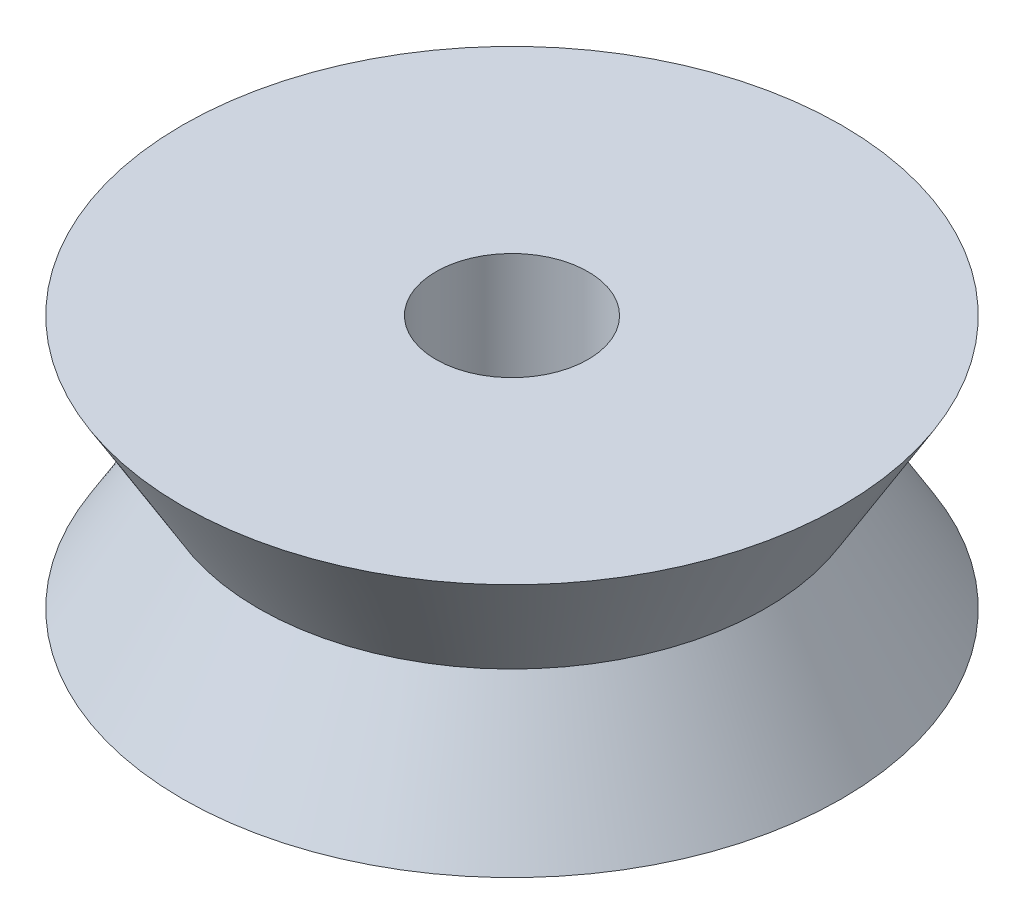
ISO-10303-21;
HEADER;
FILE_DESCRIPTION(('STEP AP214'),'2;1');
FILE_NAME('part.step','',(''),(''),'','','');
FILE_SCHEMA(('AUTOMOTIVE_DESIGN { 1 0 10303 214 1 1 1 1 }'));
ENDSEC;
DATA;
#1=APPLICATION_CONTEXT('core data for automotive mechanical design processes');
#2=APPLICATION_PROTOCOL_DEFINITION('international standard','automotive_design',2000,#1);
#3=PRODUCT_CONTEXT('',#1,'mechanical');
#4=PRODUCT('Part','Part','',(#3));
#5=PRODUCT_RELATED_PRODUCT_CATEGORY('part','',(#4));
#6=PRODUCT_DEFINITION_FORMATION('','',#4);
#7=PRODUCT_DEFINITION_CONTEXT('part definition',#1,'design');
#8=PRODUCT_DEFINITION('design','',#6,#7);
#9=PRODUCT_DEFINITION_SHAPE('','',#8);
#10=(LENGTH_UNIT() NAMED_UNIT(*) SI_UNIT(.MILLI.,.METRE.));
#11=(NAMED_UNIT(*) PLANE_ANGLE_UNIT() SI_UNIT($,.RADIAN.));
#12=(NAMED_UNIT(*) SI_UNIT($,.STERADIAN.) SOLID_ANGLE_UNIT());
#13=UNCERTAINTY_MEASURE_WITH_UNIT(LENGTH_MEASURE(1.E-05),#10,'distance_accuracy_value','');
#14=(GEOMETRIC_REPRESENTATION_CONTEXT(3) GLOBAL_UNCERTAINTY_ASSIGNED_CONTEXT((#13)) GLOBAL_UNIT_ASSIGNED_CONTEXT((#10,
#11,#12)) REPRESENTATION_CONTEXT('',''));
#15=CARTESIAN_POINT('',(0.,0.,0.));
#16=DIRECTION('',(0.,0.,1.));
#17=DIRECTION('',(1.,0.,0.));
#18=AXIS2_PLACEMENT_3D('',#15,#16,#17);
#19=CARTESIAN_POINT('',(3.,5.,0.));
#20=DIRECTION('',(0.,-1.,0.));
#21=DIRECTION('',(0.,0.,-1.));
#22=AXIS2_PLACEMENT_3D('',#19,#20,#21);
#23=PLANE('',#22);
#24=CARTESIAN_POINT('',(0.,5.,0.));
#25=DIRECTION('',(0.,1.,0.));
#26=DIRECTION('',(0.,0.,1.));
#27=AXIS2_PLACEMENT_3D('',#24,#25,#26);
#28=CIRCLE('',#27,3.);
#29=CARTESIAN_POINT('',(0.,5.,3.));
#30=VERTEX_POINT('',#29);
#31=EDGE_CURVE('E10',#30,#30,#28,.T.);
#32=ORIENTED_EDGE('',*,*,#31,.F.);
#33=EDGE_LOOP('',(#32));
#34=FACE_BOUND('',#33,.T.);
#35=CARTESIAN_POINT('',(0.,5.,0.));
#36=DIRECTION('',(0.,1.,0.));
#37=DIRECTION('',(0.,0.,1.));
#38=AXIS2_PLACEMENT_3D('',#35,#36,#37);
#39=CIRCLE('',#38,13.);
#40=CARTESIAN_POINT('',(0.,5.,13.));
#41=VERTEX_POINT('',#40);
#42=EDGE_CURVE('E50',#41,#41,#39,.T.);
#43=ORIENTED_EDGE('',*,*,#42,.T.);
#44=EDGE_LOOP('',(#43));
#45=FACE_BOUND('',#44,.T.);
#46=ADVANCED_FACE('F31',(#34,#45),#23,.F.);
#47=CARTESIAN_POINT('',(0.,5.5,0.));
#48=DIRECTION('',(0.,1.,0.));
#49=DIRECTION('',(0.,0.,1.));
#50=AXIS2_PLACEMENT_3D('',#47,#48,#49);
#51=CYLINDRICAL_SURFACE('',#50,3.);
#52=CARTESIAN_POINT('',(0.,-5.,0.));
#53=DIRECTION('',(0.,1.,0.));
#54=DIRECTION('',(0.,0.,1.));
#55=AXIS2_PLACEMENT_3D('',#52,#53,#54);
#56=CIRCLE('',#55,3.);
#57=CARTESIAN_POINT('',(0.,-5.,3.));
#58=VERTEX_POINT('',#57);
#59=EDGE_CURVE('E37',#58,#58,#56,.T.);
#60=ORIENTED_EDGE('',*,*,#59,.F.);
#61=EDGE_LOOP('',(#60));
#62=FACE_BOUND('',#61,.T.);
#63=ORIENTED_EDGE('',*,*,#31,.T.);
#64=EDGE_LOOP('',(#63));
#65=FACE_BOUND('',#64,.T.);
#66=ADVANCED_FACE('F69',(#62,#65),#51,.F.);
#67=CARTESIAN_POINT('',(13.,-5.,0.));
#68=DIRECTION('',(0.,1.,0.));
#69=DIRECTION('',(0.,0.,1.));
#70=AXIS2_PLACEMENT_3D('',#67,#68,#69);
#71=PLANE('',#70);
#72=CARTESIAN_POINT('',(0.,-5.,0.));
#73=DIRECTION('',(0.,1.,0.));
#74=DIRECTION('',(0.,0.,1.));
#75=AXIS2_PLACEMENT_3D('',#72,#73,#74);
#76=CIRCLE('',#75,13.);
#77=CARTESIAN_POINT('',(0.,-5.,13.));
#78=VERTEX_POINT('',#77);
#79=EDGE_CURVE('E41',#78,#78,#76,.T.);
#80=ORIENTED_EDGE('',*,*,#79,.F.);
#81=EDGE_LOOP('',(#80));
#82=FACE_BOUND('',#81,.T.);
#83=ORIENTED_EDGE('',*,*,#59,.T.);
#84=EDGE_LOOP('',(#83));
#85=FACE_BOUND('',#84,.T.);
#86=ADVANCED_FACE('F64',(#82,#85),#71,.F.);
#87=CARTESIAN_POINT('',(0.,-5.,0.));
#88=DIRECTION('',(0.,-1.,0.));
#89=DIRECTION('',(0.,0.,-1.));
#90=AXIS2_PLACEMENT_3D('',#87,#88,#89);
#91=CONICAL_SURFACE('',#90,13.,0.540419500270584);
#92=CARTESIAN_POINT('',(0.,0.,0.));
#93=DIRECTION('',(0.,1.,0.));
#94=DIRECTION('',(0.,0.,1.));
#95=AXIS2_PLACEMENT_3D('',#92,#93,#94);
#96=CIRCLE('',#95,10.);
#97=CARTESIAN_POINT('',(0.,0.,10.));
#98=VERTEX_POINT('',#97);
#99=EDGE_CURVE('E45',#98,#98,#96,.T.);
#100=ORIENTED_EDGE('',*,*,#99,.F.);
#101=EDGE_LOOP('',(#100));
#102=FACE_BOUND('',#101,.T.);
#103=ORIENTED_EDGE('',*,*,#79,.T.);
#104=EDGE_LOOP('',(#103));
#105=FACE_BOUND('',#104,.T.);
#106=ADVANCED_FACE('F58',(#102,#105),#91,.T.);
#107=CARTESIAN_POINT('',(0.,0.,0.));
#108=DIRECTION('',(0.,1.,0.));
#109=DIRECTION('',(0.,0.,1.));
#110=AXIS2_PLACEMENT_3D('',#107,#108,#109);
#111=CONICAL_SURFACE('',#110,10.,0.540419500270584);
#112=ORIENTED_EDGE('',*,*,#42,.F.);
#113=EDGE_LOOP('',(#112));
#114=FACE_BOUND('',#113,.T.);
#115=ORIENTED_EDGE('',*,*,#99,.T.);
#116=EDGE_LOOP('',(#115));
#117=FACE_BOUND('',#116,.T.);
#118=ADVANCED_FACE('F55',(#114,#117),#111,.T.);
#119=CLOSED_SHELL('',(#46,#66,#86,#106,#118));
#120=MANIFOLD_SOLID_BREP('B2',#119);
#121=ADVANCED_BREP_SHAPE_REPRESENTATION('',(#18,#120),#14);
#122=SHAPE_DEFINITION_REPRESENTATION(#9,#121);
ENDSEC;
END-ISO-10303-21;
